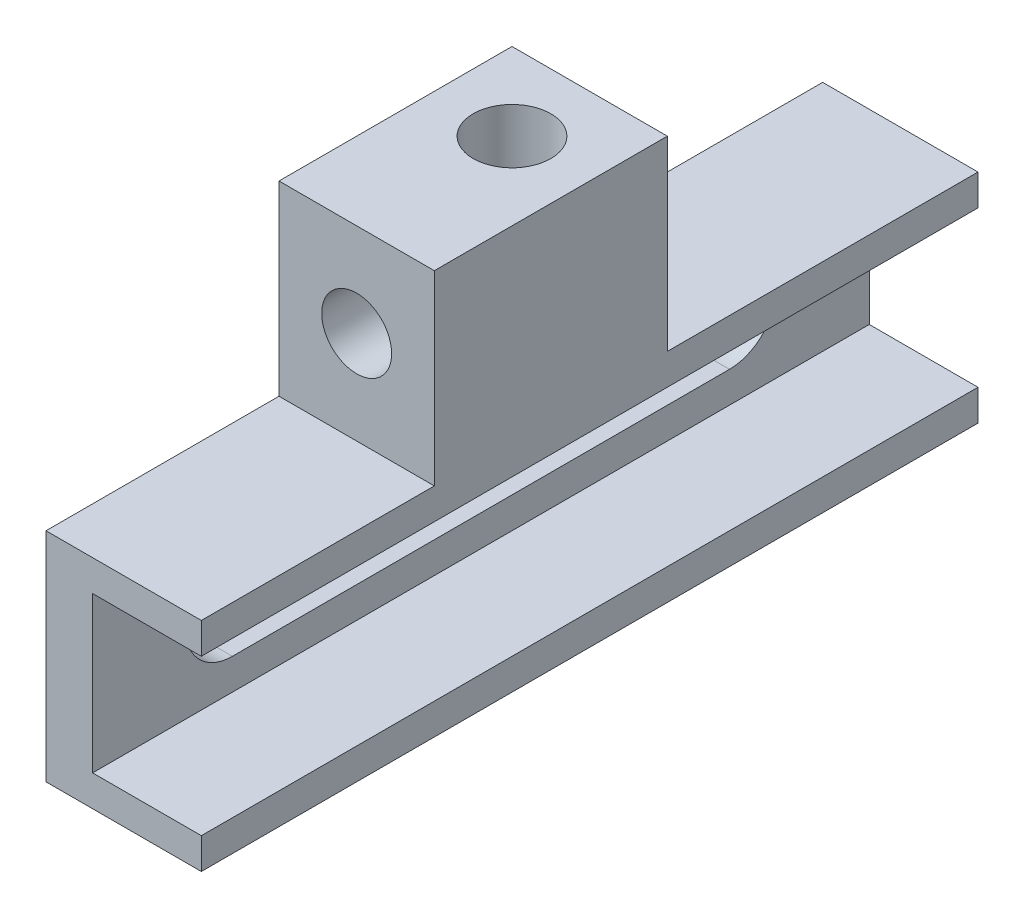
ISO-10303-21;
HEADER;
FILE_DESCRIPTION(('STEP AP214'),'2;1');
FILE_NAME('part.step','',(''),(''),'','','');
FILE_SCHEMA(('AUTOMOTIVE_DESIGN { 1 0 10303 214 1 1 1 1 }'));
ENDSEC;
DATA;
#1=APPLICATION_CONTEXT('core data for automotive mechanical design processes');
#2=APPLICATION_PROTOCOL_DEFINITION('international standard','automotive_design',2000,#1);
#3=PRODUCT_CONTEXT('',#1,'mechanical');
#4=PRODUCT('Part','Part','',(#3));
#5=PRODUCT_RELATED_PRODUCT_CATEGORY('part','',(#4));
#6=PRODUCT_DEFINITION_FORMATION('','',#4);
#7=PRODUCT_DEFINITION_CONTEXT('part definition',#1,'design');
#8=PRODUCT_DEFINITION('design','',#6,#7);
#9=PRODUCT_DEFINITION_SHAPE('','',#8);
#10=(LENGTH_UNIT() NAMED_UNIT(*) SI_UNIT(.MILLI.,.METRE.));
#11=(NAMED_UNIT(*) PLANE_ANGLE_UNIT() SI_UNIT($,.RADIAN.));
#12=(NAMED_UNIT(*) SI_UNIT($,.STERADIAN.) SOLID_ANGLE_UNIT());
#13=UNCERTAINTY_MEASURE_WITH_UNIT(LENGTH_MEASURE(1.E-05),#10,'distance_accuracy_value','');
#14=(GEOMETRIC_REPRESENTATION_CONTEXT(3) GLOBAL_UNCERTAINTY_ASSIGNED_CONTEXT((#13)) GLOBAL_UNIT_ASSIGNED_CONTEXT((#10,
#11,#12)) REPRESENTATION_CONTEXT('',''));
#15=CARTESIAN_POINT('',(0.,0.,0.));
#16=DIRECTION('',(0.,0.,1.));
#17=DIRECTION('',(1.,0.,0.));
#18=AXIS2_PLACEMENT_3D('',#15,#16,#17);
#19=CARTESIAN_POINT('',(5.,0.,50.));
#20=DIRECTION('',(-1.,0.,0.));
#21=DIRECTION('',(0.,0.,1.));
#22=AXIS2_PLACEMENT_3D('',#19,#20,#21);
#23=PLANE('',#22);
#24=DIRECTION('',(0.,1.,0.));
#25=VECTOR('',#24,1.);
#26=CARTESIAN_POINT('',(5.,0.,35.));
#27=LINE('',#26,#25);
#28=CARTESIAN_POINT('',(5.,1.,35.));
#29=VERTEX_POINT('',#28);
#30=CARTESIAN_POINT('',(5.,13.,35.));
#31=VERTEX_POINT('',#30);
#32=EDGE_CURVE('E203',#29,#31,#27,.T.);
#33=ORIENTED_EDGE('',*,*,#32,.F.);
#34=DIRECTION('',(0.,0.,-1.));
#35=VECTOR('',#34,1.);
#36=CARTESIAN_POINT('',(5.,1.,0.));
#37=LINE('',#36,#35);
#38=CARTESIAN_POINT('',(5.,1.,50.));
#39=VERTEX_POINT('',#38);
#40=EDGE_CURVE('E200',#39,#29,#37,.T.);
#41=ORIENTED_EDGE('',*,*,#40,.F.);
#42=DIRECTION('',(0.,1.,0.));
#43=VECTOR('',#42,1.);
#44=CARTESIAN_POINT('',(5.,0.,50.));
#45=LINE('',#44,#43);
#46=CARTESIAN_POINT('',(5.,-0.999999999999998,50.));
#47=VERTEX_POINT('',#46);
#48=EDGE_CURVE('E233',#47,#39,#45,.T.);
#49=ORIENTED_EDGE('',*,*,#48,.F.);
#50=DIRECTION('',(0.,0.,-1.));
#51=VECTOR('',#50,1.);
#52=CARTESIAN_POINT('',(5.,-0.999999999999998,50.));
#53=LINE('',#52,#51);
#54=CARTESIAN_POINT('',(5.,-0.999999999999998,0.));
#55=VERTEX_POINT('',#54);
#56=EDGE_CURVE('E271',#47,#55,#53,.T.);
#57=ORIENTED_EDGE('',*,*,#56,.T.);
#58=DIRECTION('',(0.,1.,0.));
#59=VECTOR('',#58,1.);
#60=CARTESIAN_POINT('',(5.,0.,0.));
#61=LINE('',#60,#59);
#62=CARTESIAN_POINT('',(5.,1.,0.));
#63=VERTEX_POINT('',#62);
#64=EDGE_CURVE('E250',#55,#63,#61,.T.);
#65=ORIENTED_EDGE('',*,*,#64,.T.);
#66=DIRECTION('',(0.,0.,-1.));
#67=VECTOR('',#66,1.);
#68=CARTESIAN_POINT('',(5.,1.,0.));
#69=LINE('',#68,#67);
#70=CARTESIAN_POINT('',(5.,1.,20.));
#71=VERTEX_POINT('',#70);
#72=EDGE_CURVE('E214',#71,#63,#69,.T.);
#73=ORIENTED_EDGE('',*,*,#72,.F.);
#74=DIRECTION('',(0.,1.,0.));
#75=VECTOR('',#74,1.);
#76=CARTESIAN_POINT('',(5.,0.,20.));
#77=LINE('',#76,#75);
#78=CARTESIAN_POINT('',(5.,13.,20.));
#79=VERTEX_POINT('',#78);
#80=EDGE_CURVE('E199',#71,#79,#77,.T.);
#81=ORIENTED_EDGE('',*,*,#80,.T.);
#82=DIRECTION('',(0.,0.,-1.));
#83=VECTOR('',#82,1.);
#84=CARTESIAN_POINT('',(5.,13.,50.));
#85=LINE('',#84,#83);
#86=EDGE_CURVE('E268',#31,#79,#85,.T.);
#87=ORIENTED_EDGE('',*,*,#86,.F.);
#88=EDGE_LOOP('',(#33,#41,#49,#57,#65,#73,#81,#87));
#89=FACE_BOUND('',#88,.T.);
#90=ADVANCED_FACE('F39',(#89),#23,.F.);
#91=CARTESIAN_POINT('',(0.,13.,50.));
#92=DIRECTION('',(0.,1.,0.));
#93=DIRECTION('',(0.,0.,1.));
#94=AXIS2_PLACEMENT_3D('',#91,#92,#93);
#95=PLANE('',#94);
#96=CARTESIAN_POINT('',(0.,13.,25.));
#97=DIRECTION('',(0.,1.,0.));
#98=DIRECTION('',(0.,0.,1.));
#99=AXIS2_PLACEMENT_3D('',#96,#97,#98);
#100=CIRCLE('',#99,2.5);
#101=CARTESIAN_POINT('',(0.,13.,27.5));
#102=VERTEX_POINT('',#101);
#103=EDGE_CURVE('E169',#102,#102,#100,.T.);
#104=ORIENTED_EDGE('',*,*,#103,.F.);
#105=EDGE_LOOP('',(#104));
#106=FACE_BOUND('',#105,.T.);
#107=DIRECTION('',(1.,0.,0.));
#108=VECTOR('',#107,1.);
#109=CARTESIAN_POINT('',(-45.,13.,35.));
#110=LINE('',#109,#108);
#111=CARTESIAN_POINT('',(-5.,13.,35.));
#112=VERTEX_POINT('',#111);
#113=EDGE_CURVE('E207',#112,#31,#110,.T.);
#114=ORIENTED_EDGE('',*,*,#113,.T.);
#115=ORIENTED_EDGE('',*,*,#86,.T.);
#116=DIRECTION('',(1.,0.,0.));
#117=VECTOR('',#116,1.);
#118=CARTESIAN_POINT('',(-45.,13.,20.));
#119=LINE('',#118,#117);
#120=CARTESIAN_POINT('',(-5.,13.,20.));
#121=VERTEX_POINT('',#120);
#122=EDGE_CURVE('E204',#121,#79,#119,.T.);
#123=ORIENTED_EDGE('',*,*,#122,.F.);
#124=DIRECTION('',(0.,0.,-1.));
#125=VECTOR('',#124,1.);
#126=CARTESIAN_POINT('',(-5.,13.,50.));
#127=LINE('',#126,#125);
#128=EDGE_CURVE('E265',#112,#121,#127,.T.);
#129=ORIENTED_EDGE('',*,*,#128,.F.);
#130=EDGE_LOOP('',(#114,#115,#123,#129));
#131=FACE_BOUND('',#130,.T.);
#132=ADVANCED_FACE('F296',(#106,#131),#95,.T.);
#133=CARTESIAN_POINT('',(-5.,0.,50.));
#134=DIRECTION('',(-1.,0.,0.));
#135=DIRECTION('',(0.,0.,1.));
#136=AXIS2_PLACEMENT_3D('',#133,#134,#135);
#137=PLANE('',#136);
#138=CARTESIAN_POINT('',(-5.,-6.,41.));
#139=DIRECTION('',(-1.,0.,0.));
#140=DIRECTION('',(0.,0.,1.));
#141=AXIS2_PLACEMENT_3D('',#138,#139,#140);
#142=CIRCLE('',#141,3.);
#143=CARTESIAN_POINT('',(-5.,-9.,41.));
#144=VERTEX_POINT('',#143);
#145=CARTESIAN_POINT('',(-5.,-3.,41.));
#146=VERTEX_POINT('',#145);
#147=EDGE_CURVE('E197',#144,#146,#142,.T.);
#148=ORIENTED_EDGE('',*,*,#147,.F.);
#149=DIRECTION('',(0.,0.,1.));
#150=VECTOR('',#149,1.);
#151=CARTESIAN_POINT('',(-5.,-9.,50.));
#152=LINE('',#151,#150);
#153=CARTESIAN_POINT('',(-5.,-9.,9.));
#154=VERTEX_POINT('',#153);
#155=EDGE_CURVE('E187',#154,#144,#152,.T.);
#156=ORIENTED_EDGE('',*,*,#155,.F.);
#157=CARTESIAN_POINT('',(-5.,-6.,9.));
#158=DIRECTION('',(-1.,0.,0.));
#159=DIRECTION('',(0.,0.,1.));
#160=AXIS2_PLACEMENT_3D('',#157,#158,#159);
#161=CIRCLE('',#160,3.);
#162=CARTESIAN_POINT('',(-5.,-3.,9.));
#163=VERTEX_POINT('',#162);
#164=EDGE_CURVE('E193',#163,#154,#161,.T.);
#165=ORIENTED_EDGE('',*,*,#164,.F.);
#166=DIRECTION('',(0.,0.,-1.));
#167=VECTOR('',#166,1.);
#168=CARTESIAN_POINT('',(-5.,-3.,50.));
#169=LINE('',#168,#167);
#170=EDGE_CURVE('E195',#146,#163,#169,.T.);
#171=ORIENTED_EDGE('',*,*,#170,.F.);
#172=EDGE_LOOP('',(#148,#156,#165,#171));
#173=FACE_BOUND('',#172,.T.);
#174=DIRECTION('',(0.,0.,1.));
#175=VECTOR('',#174,1.);
#176=CARTESIAN_POINT('',(-5.,1.,50.));
#177=LINE('',#176,#175);
#178=CARTESIAN_POINT('',(-5.,1.,35.));
#179=VERTEX_POINT('',#178);
#180=CARTESIAN_POINT('',(-5.,1.,50.));
#181=VERTEX_POINT('',#180);
#182=EDGE_CURVE('E220',#179,#181,#177,.T.);
#183=ORIENTED_EDGE('',*,*,#182,.F.);
#184=DIRECTION('',(0.,-1.,0.));
#185=VECTOR('',#184,1.);
#186=CARTESIAN_POINT('',(-5.,0.,35.));
#187=LINE('',#186,#185);
#188=EDGE_CURVE('E11',#112,#179,#187,.T.);
#189=ORIENTED_EDGE('',*,*,#188,.F.);
#190=ORIENTED_EDGE('',*,*,#128,.T.);
#191=DIRECTION('',(0.,-1.,0.));
#192=VECTOR('',#191,1.);
#193=CARTESIAN_POINT('',(-5.,0.,20.));
#194=LINE('',#193,#192);
#195=CARTESIAN_POINT('',(-5.,1.,20.));
#196=VERTEX_POINT('',#195);
#197=EDGE_CURVE('E53',#121,#196,#194,.T.);
#198=ORIENTED_EDGE('',*,*,#197,.T.);
#199=DIRECTION('',(0.,0.,1.));
#200=VECTOR('',#199,1.);
#201=CARTESIAN_POINT('',(-5.,1.,50.));
#202=LINE('',#201,#200);
#203=CARTESIAN_POINT('',(-5.,1.,0.));
#204=VERTEX_POINT('',#203);
#205=EDGE_CURVE('E210',#204,#196,#202,.T.);
#206=ORIENTED_EDGE('',*,*,#205,.F.);
#207=DIRECTION('',(0.,1.,0.));
#208=VECTOR('',#207,1.);
#209=CARTESIAN_POINT('',(-5.,0.,0.));
#210=LINE('',#209,#208);
#211=CARTESIAN_POINT('',(-5.,-13.,0.));
#212=VERTEX_POINT('',#211);
#213=EDGE_CURVE('E253',#212,#204,#210,.T.);
#214=ORIENTED_EDGE('',*,*,#213,.F.);
#215=DIRECTION('',(0.,0.,-1.));
#216=VECTOR('',#215,1.);
#217=CARTESIAN_POINT('',(-5.,-13.,50.));
#218=LINE('',#217,#216);
#219=CARTESIAN_POINT('',(-5.,-13.,50.));
#220=VERTEX_POINT('',#219);
#221=EDGE_CURVE('E263',#220,#212,#218,.T.);
#222=ORIENTED_EDGE('',*,*,#221,.F.);
#223=DIRECTION('',(0.,1.,0.));
#224=VECTOR('',#223,1.);
#225=CARTESIAN_POINT('',(-5.,0.,50.));
#226=LINE('',#225,#224);
#227=EDGE_CURVE('E236',#220,#181,#226,.T.);
#228=ORIENTED_EDGE('',*,*,#227,.T.);
#229=EDGE_LOOP('',(#183,#189,#190,#198,#206,#214,#222,#228));
#230=FACE_BOUND('',#229,.T.);
#231=ADVANCED_FACE('F286',(#173,#230),#137,.T.);
#232=CARTESIAN_POINT('',(0.,-11.,50.));
#233=DIRECTION('',(0.,1.,0.));
#234=DIRECTION('',(0.,0.,1.));
#235=AXIS2_PLACEMENT_3D('',#232,#233,#234);
#236=PLANE('',#235);
#237=DIRECTION('',(1.,0.,0.));
#238=VECTOR('',#237,1.);
#239=CARTESIAN_POINT('',(0.,-11.,0.));
#240=LINE('',#239,#238);
#241=CARTESIAN_POINT('',(-2.,-11.,0.));
#242=VERTEX_POINT('',#241);
#243=CARTESIAN_POINT('',(5.,-11.,0.));
#244=VERTEX_POINT('',#243);
#245=EDGE_CURVE('E222',#242,#244,#240,.T.);
#246=ORIENTED_EDGE('',*,*,#245,.F.);
#247=DIRECTION('',(0.,0.,-1.));
#248=VECTOR('',#247,1.);
#249=CARTESIAN_POINT('',(-2.,-11.,50.));
#250=LINE('',#249,#248);
#251=CARTESIAN_POINT('',(-2.,-11.,50.));
#252=VERTEX_POINT('',#251);
#253=EDGE_CURVE('E275',#252,#242,#250,.T.);
#254=ORIENTED_EDGE('',*,*,#253,.F.);
#255=DIRECTION('',(1.,0.,0.));
#256=VECTOR('',#255,1.);
#257=CARTESIAN_POINT('',(0.,-11.,50.));
#258=LINE('',#257,#256);
#259=CARTESIAN_POINT('',(5.,-11.,50.));
#260=VERTEX_POINT('',#259);
#261=EDGE_CURVE('E223',#252,#260,#258,.T.);
#262=ORIENTED_EDGE('',*,*,#261,.T.);
#263=DIRECTION('',(0.,0.,-1.));
#264=VECTOR('',#263,1.);
#265=CARTESIAN_POINT('',(5.,-11.,50.));
#266=LINE('',#265,#264);
#267=EDGE_CURVE('E258',#260,#244,#266,.T.);
#268=ORIENTED_EDGE('',*,*,#267,.T.);
#269=EDGE_LOOP('',(#246,#254,#262,#268));
#270=FACE_BOUND('',#269,.T.);
#271=ADVANCED_FACE('F41',(#270),#236,.T.);
#272=CARTESIAN_POINT('',(-2.,0.,50.));
#273=DIRECTION('',(1.,0.,0.));
#274=DIRECTION('',(0.,1.,0.));
#275=AXIS2_PLACEMENT_3D('',#272,#273,#274);
#276=PLANE('',#275);
#277=CARTESIAN_POINT('',(-2.,-6.,41.));
#278=DIRECTION('',(1.,0.,0.));
#279=DIRECTION('',(0.,1.,0.));
#280=AXIS2_PLACEMENT_3D('',#277,#278,#279);
#281=CIRCLE('',#280,3.);
#282=CARTESIAN_POINT('',(-2.,-3.,41.));
#283=VERTEX_POINT('',#282);
#284=CARTESIAN_POINT('',(-2.,-9.,41.));
#285=VERTEX_POINT('',#284);
#286=EDGE_CURVE('E68',#283,#285,#281,.T.);
#287=ORIENTED_EDGE('',*,*,#286,.F.);
#288=DIRECTION('',(0.,0.,1.));
#289=VECTOR('',#288,1.);
#290=CARTESIAN_POINT('',(-2.,-3.,41.));
#291=LINE('',#290,#289);
#292=CARTESIAN_POINT('',(-2.,-3.,9.));
#293=VERTEX_POINT('',#292);
#294=EDGE_CURVE('E181',#293,#283,#291,.T.);
#295=ORIENTED_EDGE('',*,*,#294,.F.);
#296=CARTESIAN_POINT('',(-2.,-6.,9.));
#297=DIRECTION('',(1.,0.,0.));
#298=DIRECTION('',(0.,1.,0.));
#299=AXIS2_PLACEMENT_3D('',#296,#297,#298);
#300=CIRCLE('',#299,3.);
#301=CARTESIAN_POINT('',(-2.,-9.,9.));
#302=VERTEX_POINT('',#301);
#303=EDGE_CURVE('E178',#302,#293,#300,.T.);
#304=ORIENTED_EDGE('',*,*,#303,.F.);
#305=DIRECTION('',(0.,0.,-1.));
#306=VECTOR('',#305,1.);
#307=CARTESIAN_POINT('',(-2.,-9.,41.));
#308=LINE('',#307,#306);
#309=EDGE_CURVE('E171',#285,#302,#308,.T.);
#310=ORIENTED_EDGE('',*,*,#309,.F.);
#311=EDGE_LOOP('',(#287,#295,#304,#310));
#312=FACE_BOUND('',#311,.T.);
#313=DIRECTION('',(0.,-1.,0.));
#314=VECTOR('',#313,1.);
#315=CARTESIAN_POINT('',(-2.,0.,0.));
#316=LINE('',#315,#314);
#317=CARTESIAN_POINT('',(-2.,-0.999999999999999,0.));
#318=VERTEX_POINT('',#317);
#319=EDGE_CURVE('E244',#318,#242,#316,.T.);
#320=ORIENTED_EDGE('',*,*,#319,.F.);
#321=DIRECTION('',(0.,0.,-1.));
#322=VECTOR('',#321,1.);
#323=CARTESIAN_POINT('',(-2.,-0.999999999999999,50.));
#324=LINE('',#323,#322);
#325=CARTESIAN_POINT('',(-2.,-0.999999999999999,50.));
#326=VERTEX_POINT('',#325);
#327=EDGE_CURVE('E273',#326,#318,#324,.T.);
#328=ORIENTED_EDGE('',*,*,#327,.F.);
#329=DIRECTION('',(0.,-1.,0.));
#330=VECTOR('',#329,1.);
#331=CARTESIAN_POINT('',(-2.,0.,50.));
#332=LINE('',#331,#330);
#333=EDGE_CURVE('E226',#326,#252,#332,.T.);
#334=ORIENTED_EDGE('',*,*,#333,.T.);
#335=ORIENTED_EDGE('',*,*,#253,.T.);
#336=EDGE_LOOP('',(#320,#328,#334,#335));
#337=FACE_BOUND('',#336,.T.);
#338=ADVANCED_FACE('F331',(#312,#337),#276,.T.);
#339=CARTESIAN_POINT('',(0.,-0.999999999999998,50.));
#340=DIRECTION('',(0.,-1.,0.));
#341=DIRECTION('',(1.,0.,0.));
#342=AXIS2_PLACEMENT_3D('',#339,#340,#341);
#343=PLANE('',#342);
#344=DIRECTION('',(-1.,0.,0.));
#345=VECTOR('',#344,1.);
#346=CARTESIAN_POINT('',(0.,-0.999999999999998,0.));
#347=LINE('',#346,#345);
#348=EDGE_CURVE('E247',#55,#318,#347,.T.);
#349=ORIENTED_EDGE('',*,*,#348,.F.);
#350=ORIENTED_EDGE('',*,*,#56,.F.);
#351=DIRECTION('',(-1.,0.,0.));
#352=VECTOR('',#351,1.);
#353=CARTESIAN_POINT('',(0.,-0.999999999999998,50.));
#354=LINE('',#353,#352);
#355=EDGE_CURVE('E230',#47,#326,#354,.T.);
#356=ORIENTED_EDGE('',*,*,#355,.T.);
#357=ORIENTED_EDGE('',*,*,#327,.T.);
#358=EDGE_LOOP('',(#349,#350,#356,#357));
#359=FACE_BOUND('',#358,.T.);
#360=ADVANCED_FACE('F327',(#359),#343,.T.);
#361=CARTESIAN_POINT('',(0.,-13.,50.));
#362=DIRECTION('',(0.,1.,0.));
#363=DIRECTION('',(0.,0.,1.));
#364=AXIS2_PLACEMENT_3D('',#361,#362,#363);
#365=PLANE('',#364);
#366=DIRECTION('',(1.,0.,0.));
#367=VECTOR('',#366,1.);
#368=CARTESIAN_POINT('',(0.,-13.,0.));
#369=LINE('',#368,#367);
#370=CARTESIAN_POINT('',(5.,-13.,0.));
#371=VERTEX_POINT('',#370);
#372=EDGE_CURVE('E256',#212,#371,#369,.T.);
#373=ORIENTED_EDGE('',*,*,#372,.T.);
#374=DIRECTION('',(0.,0.,-1.));
#375=VECTOR('',#374,1.);
#376=CARTESIAN_POINT('',(5.,-13.,50.));
#377=LINE('',#376,#375);
#378=CARTESIAN_POINT('',(5.,-13.,50.));
#379=VERTEX_POINT('',#378);
#380=EDGE_CURVE('E260',#379,#371,#377,.T.);
#381=ORIENTED_EDGE('',*,*,#380,.F.);
#382=DIRECTION('',(1.,0.,0.));
#383=VECTOR('',#382,1.);
#384=CARTESIAN_POINT('',(0.,-13.,50.));
#385=LINE('',#384,#383);
#386=EDGE_CURVE('E240',#220,#379,#385,.T.);
#387=ORIENTED_EDGE('',*,*,#386,.F.);
#388=ORIENTED_EDGE('',*,*,#221,.T.);
#389=EDGE_LOOP('',(#373,#381,#387,#388));
#390=FACE_BOUND('',#389,.T.);
#391=ADVANCED_FACE('F314',(#390),#365,.F.);
#392=EDGE_CURVE('E227',#371,#244,#61,.T.);
#393=ORIENTED_EDGE('',*,*,#392,.T.);
#394=ORIENTED_EDGE('',*,*,#267,.F.);
#395=EDGE_CURVE('E237',#379,#260,#45,.T.);
#396=ORIENTED_EDGE('',*,*,#395,.F.);
#397=ORIENTED_EDGE('',*,*,#380,.T.);
#398=EDGE_LOOP('',(#393,#394,#396,#397));
#399=FACE_BOUND('',#398,.T.);
#400=ADVANCED_FACE('F336',(#399),#23,.F.);
#401=CARTESIAN_POINT('',(0.,0.,50.));
#402=DIRECTION('',(0.,0.,1.));
#403=DIRECTION('',(1.,0.,0.));
#404=AXIS2_PLACEMENT_3D('',#401,#402,#403);
#405=PLANE('',#404);
#406=DIRECTION('',(1.,0.,0.));
#407=VECTOR('',#406,1.);
#408=CARTESIAN_POINT('',(0.,1.,50.));
#409=LINE('',#408,#407);
#410=EDGE_CURVE('E280',#181,#39,#409,.T.);
#411=ORIENTED_EDGE('',*,*,#410,.F.);
#412=ORIENTED_EDGE('',*,*,#227,.F.);
#413=ORIENTED_EDGE('',*,*,#386,.T.);
#414=ORIENTED_EDGE('',*,*,#395,.T.);
#415=ORIENTED_EDGE('',*,*,#261,.F.);
#416=ORIENTED_EDGE('',*,*,#333,.F.);
#417=ORIENTED_EDGE('',*,*,#355,.F.);
#418=ORIENTED_EDGE('',*,*,#48,.T.);
#419=EDGE_LOOP('',(#411,#412,#413,#414,#415,#416,#417,#418));
#420=FACE_BOUND('',#419,.T.);
#421=ADVANCED_FACE('F318',(#420),#405,.T.);
#422=CARTESIAN_POINT('',(0.,0.,0.));
#423=DIRECTION('',(0.,0.,1.));
#424=DIRECTION('',(1.,0.,0.));
#425=AXIS2_PLACEMENT_3D('',#422,#423,#424);
#426=PLANE('',#425);
#427=ORIENTED_EDGE('',*,*,#213,.T.);
#428=DIRECTION('',(1.,0.,0.));
#429=VECTOR('',#428,1.);
#430=CARTESIAN_POINT('',(0.,1.,0.));
#431=LINE('',#430,#429);
#432=EDGE_CURVE('E277',#204,#63,#431,.T.);
#433=ORIENTED_EDGE('',*,*,#432,.T.);
#434=ORIENTED_EDGE('',*,*,#64,.F.);
#435=ORIENTED_EDGE('',*,*,#348,.T.);
#436=ORIENTED_EDGE('',*,*,#319,.T.);
#437=ORIENTED_EDGE('',*,*,#245,.T.);
#438=ORIENTED_EDGE('',*,*,#392,.F.);
#439=ORIENTED_EDGE('',*,*,#372,.F.);
#440=EDGE_LOOP('',(#427,#433,#434,#435,#436,#437,#438,#439));
#441=FACE_BOUND('',#440,.T.);
#442=ADVANCED_FACE('F306',(#441),#426,.F.);
#443=CARTESIAN_POINT('',(-45.,0.,20.));
#444=DIRECTION('',(0.,0.,-1.));
#445=DIRECTION('',(-1.,0.,0.));
#446=AXIS2_PLACEMENT_3D('',#443,#444,#445);
#447=PLANE('',#446);
#448=ORIENTED_EDGE('',*,*,#122,.T.);
#449=ORIENTED_EDGE('',*,*,#80,.F.);
#450=DIRECTION('',(1.,0.,0.));
#451=VECTOR('',#450,1.);
#452=CARTESIAN_POINT('',(-45.,1.,20.));
#453=LINE('',#452,#451);
#454=EDGE_CURVE('E216',#196,#71,#453,.T.);
#455=ORIENTED_EDGE('',*,*,#454,.F.);
#456=ORIENTED_EDGE('',*,*,#197,.F.);
#457=EDGE_LOOP('',(#448,#449,#455,#456));
#458=FACE_BOUND('',#457,.T.);
#459=ADVANCED_FACE('F293',(#458),#447,.T.);
#460=CARTESIAN_POINT('',(-45.,1.,0.));
#461=DIRECTION('',(0.,-1.,0.));
#462=DIRECTION('',(0.,0.,-1.));
#463=AXIS2_PLACEMENT_3D('',#460,#461,#462);
#464=PLANE('',#463);
#465=ORIENTED_EDGE('',*,*,#205,.T.);
#466=ORIENTED_EDGE('',*,*,#454,.T.);
#467=ORIENTED_EDGE('',*,*,#72,.T.);
#468=ORIENTED_EDGE('',*,*,#432,.F.);
#469=EDGE_LOOP('',(#465,#466,#467,#468));
#470=FACE_BOUND('',#469,.T.);
#471=ADVANCED_FACE('F304',(#470),#464,.F.);
#472=CARTESIAN_POINT('',(-45.,1.,0.));
#473=DIRECTION('',(0.,-1.,0.));
#474=DIRECTION('',(0.,0.,-1.));
#475=AXIS2_PLACEMENT_3D('',#472,#473,#474);
#476=PLANE('',#475);
#477=ORIENTED_EDGE('',*,*,#182,.T.);
#478=ORIENTED_EDGE('',*,*,#410,.T.);
#479=ORIENTED_EDGE('',*,*,#40,.T.);
#480=DIRECTION('',(1.,0.,0.));
#481=VECTOR('',#480,1.);
#482=CARTESIAN_POINT('',(-45.,1.,35.));
#483=LINE('',#482,#481);
#484=EDGE_CURVE('E206',#179,#29,#483,.T.);
#485=ORIENTED_EDGE('',*,*,#484,.F.);
#486=EDGE_LOOP('',(#477,#478,#479,#485));
#487=FACE_BOUND('',#486,.T.);
#488=ADVANCED_FACE('F322',(#487),#476,.F.);
#489=CARTESIAN_POINT('',(-45.,0.,35.));
#490=DIRECTION('',(0.,0.,-1.));
#491=DIRECTION('',(0.,1.,0.));
#492=AXIS2_PLACEMENT_3D('',#489,#490,#491);
#493=PLANE('',#492);
#494=CARTESIAN_POINT('',(0.,7.,35.));
#495=DIRECTION('',(0.,0.,1.));
#496=DIRECTION('',(1.,0.,0.));
#497=AXIS2_PLACEMENT_3D('',#494,#495,#496);
#498=CIRCLE('',#497,2.25);
#499=CARTESIAN_POINT('',(2.25,7.,35.));
#500=VERTEX_POINT('',#499);
#501=EDGE_CURVE('E477',#500,#500,#498,.T.);
#502=ORIENTED_EDGE('',*,*,#501,.F.);
#503=EDGE_LOOP('',(#502));
#504=FACE_BOUND('',#503,.T.);
#505=ORIENTED_EDGE('',*,*,#188,.T.);
#506=ORIENTED_EDGE('',*,*,#484,.T.);
#507=ORIENTED_EDGE('',*,*,#32,.T.);
#508=ORIENTED_EDGE('',*,*,#113,.F.);
#509=EDGE_LOOP('',(#505,#506,#507,#508));
#510=FACE_BOUND('',#509,.T.);
#511=ADVANCED_FACE('F390',(#504,#510),#493,.F.);
#512=CARTESIAN_POINT('',(-52.,-6.00000000000001,41.));
#513=DIRECTION('',(1.,0.,0.));
#514=DIRECTION('',(0.,1.,0.));
#515=AXIS2_PLACEMENT_3D('',#512,#513,#514);
#516=CYLINDRICAL_SURFACE('',#515,3.);
#517=ORIENTED_EDGE('',*,*,#147,.T.);
#518=DIRECTION('',(1.,0.,0.));
#519=VECTOR('',#518,1.);
#520=CARTESIAN_POINT('',(-52.,-3.00000000000001,41.));
#521=LINE('',#520,#519);
#522=EDGE_CURVE('E185',#146,#283,#521,.T.);
#523=ORIENTED_EDGE('',*,*,#522,.T.);
#524=ORIENTED_EDGE('',*,*,#286,.T.);
#525=DIRECTION('',(1.,0.,0.));
#526=VECTOR('',#525,1.);
#527=CARTESIAN_POINT('',(-52.,-9.00000000000001,41.));
#528=LINE('',#527,#526);
#529=EDGE_CURVE('E184',#144,#285,#528,.T.);
#530=ORIENTED_EDGE('',*,*,#529,.F.);
#531=EDGE_LOOP('',(#517,#523,#524,#530));
#532=FACE_BOUND('',#531,.T.);
#533=ADVANCED_FACE('F370',(#532),#516,.F.);
#534=CARTESIAN_POINT('',(-52.,-3.00000000000001,41.));
#535=DIRECTION('',(0.,1.,0.));
#536=DIRECTION('',(-1.,0.,0.));
#537=AXIS2_PLACEMENT_3D('',#534,#535,#536);
#538=PLANE('',#537);
#539=ORIENTED_EDGE('',*,*,#170,.T.);
#540=DIRECTION('',(1.,0.,0.));
#541=VECTOR('',#540,1.);
#542=CARTESIAN_POINT('',(-52.,-3.00000000000001,9.));
#543=LINE('',#542,#541);
#544=EDGE_CURVE('E188',#163,#293,#543,.T.);
#545=ORIENTED_EDGE('',*,*,#544,.T.);
#546=ORIENTED_EDGE('',*,*,#294,.T.);
#547=ORIENTED_EDGE('',*,*,#522,.F.);
#548=EDGE_LOOP('',(#539,#545,#546,#547));
#549=FACE_BOUND('',#548,.T.);
#550=ADVANCED_FACE('F376',(#549),#538,.F.);
#551=CARTESIAN_POINT('',(-52.,-6.00000000000001,9.));
#552=DIRECTION('',(1.,0.,0.));
#553=DIRECTION('',(0.,1.,0.));
#554=AXIS2_PLACEMENT_3D('',#551,#552,#553);
#555=CYLINDRICAL_SURFACE('',#554,3.);
#556=ORIENTED_EDGE('',*,*,#164,.T.);
#557=DIRECTION('',(1.,0.,0.));
#558=VECTOR('',#557,1.);
#559=CARTESIAN_POINT('',(-52.,-9.00000000000001,9.));
#560=LINE('',#559,#558);
#561=EDGE_CURVE('E60',#154,#302,#560,.T.);
#562=ORIENTED_EDGE('',*,*,#561,.T.);
#563=ORIENTED_EDGE('',*,*,#303,.T.);
#564=ORIENTED_EDGE('',*,*,#544,.F.);
#565=EDGE_LOOP('',(#556,#562,#563,#564));
#566=FACE_BOUND('',#565,.T.);
#567=ADVANCED_FACE('F378',(#566),#555,.F.);
#568=CARTESIAN_POINT('',(-52.,-9.00000000000001,41.));
#569=DIRECTION('',(0.,-1.,0.));
#570=DIRECTION('',(1.,0.,0.));
#571=AXIS2_PLACEMENT_3D('',#568,#569,#570);
#572=PLANE('',#571);
#573=ORIENTED_EDGE('',*,*,#155,.T.);
#574=ORIENTED_EDGE('',*,*,#529,.T.);
#575=ORIENTED_EDGE('',*,*,#309,.T.);
#576=ORIENTED_EDGE('',*,*,#561,.F.);
#577=EDGE_LOOP('',(#573,#574,#575,#576));
#578=FACE_BOUND('',#577,.T.);
#579=ADVANCED_FACE('F163',(#578),#572,.F.);
#580=CARTESIAN_POINT('',(0.,3.,25.));
#581=DIRECTION('',(0.,1.,0.));
#582=DIRECTION('',(0.,0.,1.));
#583=AXIS2_PLACEMENT_3D('',#580,#581,#582);
#584=CONICAL_SURFACE('',#583,2.5,1.02974425867665);
#585=CARTESIAN_POINT('',(0.,1.4978484524311,25.));
#586=VERTEX_POINT('',#585);
#587=VERTEX_LOOP('',#586);
#588=FACE_BOUND('',#587,.T.);
#589=CARTESIAN_POINT('',(0.,3.,25.));
#590=DIRECTION('',(0.,1.,0.));
#591=DIRECTION('',(0.,0.,1.));
#592=AXIS2_PLACEMENT_3D('',#589,#590,#591);
#593=CIRCLE('',#592,2.5);
#594=CARTESIAN_POINT('',(0.,3.,27.5));
#595=VERTEX_POINT('',#594);
#596=EDGE_CURVE('E167',#595,#595,#593,.T.);
#597=ORIENTED_EDGE('',*,*,#596,.T.);
#598=EDGE_LOOP('',(#597));
#599=FACE_BOUND('',#598,.T.);
#600=ADVANCED_FACE('F159',(#588,#599),#584,.F.);
#601=CARTESIAN_POINT('',(0.,13.,25.));
#602=DIRECTION('',(0.,1.,0.));
#603=DIRECTION('',(0.,0.,1.));
#604=AXIS2_PLACEMENT_3D('',#601,#602,#603);
#605=CYLINDRICAL_SURFACE('',#604,2.5);
#606=CARTESIAN_POINT('',(0.,4.75,27.5));
#607=CARTESIAN_POINT('',(0.104279528252597,4.75000669399309,27.4999933874142));
#608=CARTESIAN_POINT('',(0.208613975894445,4.75730715311742,27.4934173425929));
#609=CARTESIAN_POINT('',(0.413764468048447,4.78594008984515,27.4676959540295));
#610=CARTESIAN_POINT('',(0.514576887905922,4.80728659937662,27.448538041106));
#611=CARTESIAN_POINT('',(0.70918268128058,4.862307781763,27.3993906736173));
#612=CARTESIAN_POINT('',(0.803016568856092,4.89590329220209,27.3694707875127));
#613=CARTESIAN_POINT('',(0.982688642808456,4.97356927047626,27.3007815518513));
#614=CARTESIAN_POINT('',(1.06852386357383,5.01764360213351,27.2620089382663));
#615=CARTESIAN_POINT('',(1.26373160042089,5.13372065457232,27.1608745307637));
#616=CARTESIAN_POINT('',(1.36894966330264,5.20986911624929,27.0952539747613));
#617=CARTESIAN_POINT('',(1.5619841810442,5.37551126890325,26.9556258181599));
#618=CARTESIAN_POINT('',(1.64975663026207,5.46503773420856,26.8815977302081));
#619=CARTESIAN_POINT('',(1.81009669390953,5.65756333151156,26.7280308387138));
#620=CARTESIAN_POINT('',(1.88225935380786,5.76082923144281,26.6484035028941));
#621=CARTESIAN_POINT('',(1.97723871960289,5.92437125760276,26.5307135072193));
#622=CARTESIAN_POINT('',(2.00667590372241,5.98029455712656,26.4917950734734));
#623=CARTESIAN_POINT('',(2.06110245611566,6.09534081763946,26.4156400896111));
#624=CARTESIAN_POINT('',(2.08609467481048,6.1544616961616,26.3784024731553));
#625=CARTESIAN_POINT('',(2.13136996988097,6.27614606437429,26.3072989259138));
#626=CARTESIAN_POINT('',(2.15166939818151,6.33869663081168,26.2734215296057));
#627=CARTESIAN_POINT('',(2.18721896383732,6.46796863141785,26.2113415956948));
#628=CARTESIAN_POINT('',(2.20247400792818,6.53468593697994,26.1831335539799));
#629=CARTESIAN_POINT('',(2.22504613086103,6.66082097245725,26.1400286012052));
#630=CARTESIAN_POINT('',(2.23326973982018,6.71956289712016,26.1236867909809));
#631=CARTESIAN_POINT('',(2.24504871126275,6.83922972071787,26.0999732094942));
#632=CARTESIAN_POINT('',(2.24861666685275,6.90014827100431,26.0925772445369));
#633=CARTESIAN_POINT('',(2.25072362868114,7.02280009276506,26.0882338308268));
#634=CARTESIAN_POINT('',(2.24923554081373,7.08453598213857,26.0913426742952));
#635=CARTESIAN_POINT('',(2.24134826423769,7.20642307358279,26.107442683552));
#636=CARTESIAN_POINT('',(2.23493829000976,7.26657049496777,26.1204555518604));
#637=CARTESIAN_POINT('',(2.21411307321897,7.40915005037667,26.1612093269626));
#638=CARTESIAN_POINT('',(2.19744420773406,7.49008370611039,26.1928723249251));
#639=CARTESIAN_POINT('',(2.15676498625213,7.64607765468357,26.2649442513199));
#640=CARTESIAN_POINT('',(2.13272377734375,7.72111156700591,26.3053897223047));
#641=CARTESIAN_POINT('',(2.08011685481127,7.86066246859662,26.3875614280819));
#642=CARTESIAN_POINT('',(2.05201699697465,7.92554686823516,26.4289719527718));
#643=CARTESIAN_POINT('',(1.99041417030942,8.05150908997813,26.5136034945915));
#644=CARTESIAN_POINT('',(1.95690710059069,8.11258397376983,26.5568258672835));
#645=CARTESIAN_POINT('',(1.88456038975792,8.23115823119293,26.643662770301));
#646=CARTESIAN_POINT('',(1.84572246441379,8.28865874664099,26.6872771702461));
#647=CARTESIAN_POINT('',(1.76265578607342,8.40013399416014,26.773879631612));
#648=CARTESIAN_POINT('',(1.71842595618471,8.45410801858936,26.8168675659869));
#649=CARTESIAN_POINT('',(1.59097837454605,8.59554045460128,26.931447313068));
#650=CARTESIAN_POINT('',(1.50242604174189,8.6794729308316,27.0016088440967));
#651=CARTESIAN_POINT('',(1.30897659039485,8.83421679254824,27.1331239595179));
#652=CARTESIAN_POINT('',(1.20411432783663,8.90505547019075,27.1944958031977));
#653=CARTESIAN_POINT('',(1.00448572826744,9.01578154756443,27.2913610324726));
#654=CARTESIAN_POINT('',(0.912919185506886,9.05904143238827,27.3295614325808));
#655=CARTESIAN_POINT('',(0.721535047852076,9.13363782847119,27.3957490741737));
#656=CARTESIAN_POINT('',(0.621722133226013,9.16498104726673,27.4237420607434));
#657=CARTESIAN_POINT('',(0.415308073403252,9.21389652023917,27.467532695055));
#658=CARTESIAN_POINT('',(0.308662208916133,9.23136528117767,27.4832386780053));
#659=CARTESIAN_POINT('',(0.0928450287028463,9.25068692373204,27.5006144468191));
#660=CARTESIAN_POINT('',(-0.0163247033305406,9.25254934499609,27.5022928073109));
#661=CARTESIAN_POINT('',(-0.220255063260222,9.24124485892667,27.4921226431318));
#662=CARTESIAN_POINT('',(-0.315200695538183,9.2298192747302,27.4818413366737));
#663=CARTESIAN_POINT('',(-0.50125291457881,9.19549466933124,27.4510486381455));
#664=CARTESIAN_POINT('',(-0.592358961158336,9.17259403953206,27.4305358118007));
#665=CARTESIAN_POINT('',(-0.770936395331468,9.11592918046002,27.3800183455179));
#666=CARTESIAN_POINT('',(-0.858263160822586,9.08191147432283,27.34979254135));
#667=CARTESIAN_POINT('',(-1.02558160824575,9.00478999487529,27.2817438018268));
#668=CARTESIAN_POINT('',(-1.1055701373603,8.96168234213172,27.2439176230879));
#669=CARTESIAN_POINT('',(-1.29556617837885,8.84443517317308,27.1420132241096));
#670=CARTESIAN_POINT('',(-1.40066523221305,8.76553756286408,27.0742472358862));
#671=CARTESIAN_POINT('',(-1.59300243579923,8.59421753861461,26.9304942118516));
#672=CARTESIAN_POINT('',(-1.68018658429551,8.50175563267188,26.8544833457384));
#673=CARTESIAN_POINT('',(-1.7986184379397,8.35336246123903,26.7372849825165));
#674=CARTESIAN_POINT('',(-1.8364002573509,8.30162439077602,26.697205872194));
#675=CARTESIAN_POINT('',(-1.90740586078073,8.19515668699337,26.6169932401645));
#676=CARTESIAN_POINT('',(-1.94063097405922,8.14042793264406,26.5768597377893));
#677=CARTESIAN_POINT('',(-2.00247516057733,8.02796179693461,26.4975367923705));
#678=CARTESIAN_POINT('',(-2.03110286333436,7.97023032808907,26.4583457008524));
#679=CARTESIAN_POINT('',(-2.08371930352927,7.8513729589246,26.3821187935457));
#680=CARTESIAN_POINT('',(-2.10771183261941,7.79024988613903,26.3450812336184));
#681=CARTESIAN_POINT('',(-2.14960010513459,7.66759402647971,26.2769982036033));
#682=CARTESIAN_POINT('',(-2.16776265621287,7.60627720620401,26.2457329873536));
#683=CARTESIAN_POINT('',(-2.19923425261915,7.4796961033375,26.1892902159327));
#684=CARTESIAN_POINT('',(-2.21255032169596,7.41443769441314,26.1641038689685));
#685=CARTESIAN_POINT('',(-2.23184678975816,7.29086950148771,26.1266045343738));
#686=CARTESIAN_POINT('',(-2.23866469476787,7.23314010535458,26.1128692466421));
#687=CARTESIAN_POINT('',(-2.24777410260066,7.11595442214474,26.0943613435101));
#688=CARTESIAN_POINT('',(-2.25007555651296,7.05650222509611,26.089569025227));
#689=CARTESIAN_POINT('',(-2.24992042453634,6.93748169076012,26.089888743882));
#690=CARTESIAN_POINT('',(-2.24745187320878,6.87791343683142,26.0950256881365));
#691=CARTESIAN_POINT('',(-2.23800233320623,6.76056113635442,26.114205067398));
#692=CARTESIAN_POINT('',(-2.23101140824083,6.70278131286376,26.1282671108163));
#693=CARTESIAN_POINT('',(-2.20818191204766,6.55928909061428,26.1725282669467));
#694=CARTESIAN_POINT('',(-2.1895987717622,6.47548940447305,26.2073446929566));
#695=CARTESIAN_POINT('',(-2.14458146427143,6.314187478535,26.285621766787));
#696=CARTESIAN_POINT('',(-2.11811323438097,6.23671445818804,26.3291196427437));
#697=CARTESIAN_POINT('',(-2.06089783424389,6.09417601860354,26.4160378161351));
#698=CARTESIAN_POINT('',(-2.03077797691714,6.02862685421606,26.4590887253021));
#699=CARTESIAN_POINT('',(-1.96488607257511,5.90142898988293,26.5466838556864));
#700=CARTESIAN_POINT('',(-1.92910995599783,5.83978314336374,26.5912291337515));
#701=CARTESIAN_POINT('',(-1.85196246778721,5.72023912416137,26.6803899339453));
#702=CARTESIAN_POINT('',(-1.81059538753554,5.6623381270026,26.7250053765112));
#703=CARTESIAN_POINT('',(-1.72217518744213,5.550273836478,26.8132897029095));
#704=CARTESIAN_POINT('',(-1.67512124499698,5.49611108563317,26.8569584487222));
#705=CARTESIAN_POINT('',(-1.54414036865067,5.35930961464129,26.9690082885835));
#706=CARTESIAN_POINT('',(-1.45546477825854,5.27988106470967,27.0358904443268));
#707=CARTESIAN_POINT('',(-1.26270846567012,5.1338207876434,27.1607194172485));
#708=CARTESIAN_POINT('',(-1.15865622256829,5.06716591568559,27.2186823569974));
#709=CARTESIAN_POINT('',(-0.959902046797044,4.96263957112537,27.3103799420795));
#710=CARTESIAN_POINT('',(-0.868013313247406,4.92166075198494,27.3466440561167));
#711=CARTESIAN_POINT('',(-0.676502292094008,4.85170090560685,27.4088235000231));
#712=CARTESIAN_POINT('',(-0.576891845212112,4.82270192400884,27.4347543144827));
#713=CARTESIAN_POINT('',(-0.397600660053786,4.78400500379162,27.4694293095571));
#714=CARTESIAN_POINT('',(-0.319071431077909,4.7713094144236,27.4808361287994));
#715=CARTESIAN_POINT('',(-0.16037233714461,4.75430418371749,27.4961241556645));
#716=CARTESIAN_POINT('',(-0.0802024118041922,4.74999485158401,27.5000050858049));
#717=CARTESIAN_POINT('',(0.,4.75,27.5));
#718=B_SPLINE_CURVE_WITH_KNOTS('',3,(#606,#607,#608,#609,#610,#611,#612,#613,#614,#615,#616,
#617,#618,#619,#620,#621,#622,#623,#624,#625,#626,#627,#628,#629,#630,#631,#632,#633,#634,#635,
#636,#637,#638,#639,#640,#641,#642,#643,#644,#645,#646,#647,#648,#649,#650,#651,#652,#653,#654,
#655,#656,#657,#658,#659,#660,#661,#662,#663,#664,#665,#666,#667,#668,#669,#670,#671,#672,#673,
#674,#675,#676,#677,#678,#679,#680,#681,#682,#683,#684,#685,#686,#687,#688,#689,#690,#691,#692,
#693,#694,#695,#696,#697,#698,#699,#700,#701,#702,#703,#704,#705,#706,#707,#708,#709,#710,#711,
#712,#713,#714,#715,#716,#717),.UNSPECIFIED.,.T.,.F.,(4,2,2,2,2,2,2,2,2,2,2,2,2,2,2,2,2,2,2,2,2,
2,2,2,2,2,2,2,2,2,2,2,2,2,2,2,2,2,2,2,2,2,2,2,2,2,2,2,2,2,2,2,2,2,2,4),(0.,0.312493006525348,
0.625298666792529,0.936117568346008,1.24705125538643,1.68121875952114,2.1164679044806,
2.5619266799017,2.784425409738,3.00678093937654,3.22834958783626,3.449702075327,
3.63358915275712,3.81697779464684,4.00135071814923,4.18612882224811,4.45010753993079,
4.71520643141201,4.96070792545032,5.20639649325579,5.45200616924765,5.69766497999022,
6.11826124140374,6.53797069269712,6.86142651169731,7.18469999655661,7.51036279248599,
7.83582650680068,8.12302392045175,8.4102616053246,8.70456801774012,8.99900029022519,
9.44018094574682,9.88267255942681,10.109220856086,10.3357029239792,10.5617547778652,
10.7876209271014,11.0007969017616,11.213662689902,11.392143051865,11.570229724856,
11.7487637037833,11.9276912854174,12.2040010587615,12.4815222079707,12.7332203887498,
12.9851004922665,13.2367883499945,13.4885126579898,13.8965990832975,14.3039389507496,
14.6235432373328,14.9426667751168,15.1829993619195,15.4233408097113),.UNSPECIFIED.);
#719=CARTESIAN_POINT('',(0.,4.75,27.5));
#720=VERTEX_POINT('',#719);
#721=EDGE_CURVE('E43',#720,#720,#718,.T.);
#722=ORIENTED_EDGE('',*,*,#721,.T.);
#723=EDGE_LOOP('',(#722));
#724=FACE_BOUND('',#723,.T.);
#725=ORIENTED_EDGE('',*,*,#596,.F.);
#726=EDGE_LOOP('',(#725));
#727=FACE_BOUND('',#726,.T.);
#728=ORIENTED_EDGE('',*,*,#103,.T.);
#729=EDGE_LOOP('',(#728));
#730=FACE_BOUND('',#729,.T.);
#731=ADVANCED_FACE('F162',(#724,#727,#730),#605,.F.);
#732=CARTESIAN_POINT('',(0.,7.,25.));
#733=DIRECTION('',(0.,0.,1.));
#734=DIRECTION('',(1.,0.,0.));
#735=AXIS2_PLACEMENT_3D('',#732,#733,#734);
#736=CYLINDRICAL_SURFACE('',#735,2.25);
#737=ORIENTED_EDGE('',*,*,#501,.T.);
#738=EDGE_LOOP('',(#737));
#739=FACE_BOUND('',#738,.T.);
#740=ORIENTED_EDGE('',*,*,#721,.F.);
#741=EDGE_LOOP('',(#740));
#742=FACE_BOUND('',#741,.T.);
#743=ADVANCED_FACE('F460',(#739,#742),#736,.F.);
#744=CLOSED_SHELL('',(#90,#132,#231,#271,#338,#360,#391,#400,#421,#442,#459,#471,#488,#511,#533,
#550,#567,#579,#600,#731,#743));
#745=MANIFOLD_SOLID_BREP('B2',#744);
#746=ADVANCED_BREP_SHAPE_REPRESENTATION('',(#18,#745),#14);
#747=SHAPE_DEFINITION_REPRESENTATION(#9,#746);
ENDSEC;
END-ISO-10303-21;
